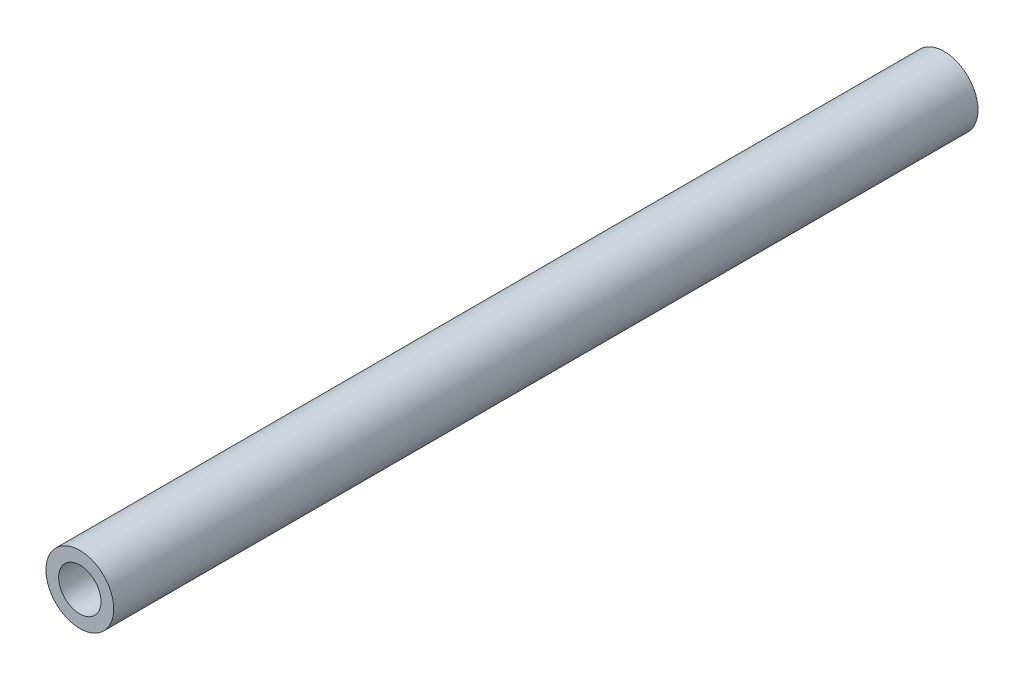
ISO-10303-21;
HEADER;
FILE_DESCRIPTION(('STEP AP214'),'2;1');
FILE_NAME('part.step','',(''),(''),'','','');
FILE_SCHEMA(('AUTOMOTIVE_DESIGN { 1 0 10303 214 1 1 1 1 }'));
ENDSEC;
DATA;
#1=APPLICATION_CONTEXT('core data for automotive mechanical design processes');
#2=APPLICATION_PROTOCOL_DEFINITION('international standard','automotive_design',2000,#1);
#3=PRODUCT_CONTEXT('',#1,'mechanical');
#4=PRODUCT('Part','Part','',(#3));
#5=PRODUCT_RELATED_PRODUCT_CATEGORY('part','',(#4));
#6=PRODUCT_DEFINITION_FORMATION('','',#4);
#7=PRODUCT_DEFINITION_CONTEXT('part definition',#1,'design');
#8=PRODUCT_DEFINITION('design','',#6,#7);
#9=PRODUCT_DEFINITION_SHAPE('','',#8);
#10=(LENGTH_UNIT() NAMED_UNIT(*) SI_UNIT(.MILLI.,.METRE.));
#11=(NAMED_UNIT(*) PLANE_ANGLE_UNIT() SI_UNIT($,.RADIAN.));
#12=(NAMED_UNIT(*) SI_UNIT($,.STERADIAN.) SOLID_ANGLE_UNIT());
#13=UNCERTAINTY_MEASURE_WITH_UNIT(LENGTH_MEASURE(1.E-05),#10,'distance_accuracy_value','');
#14=(GEOMETRIC_REPRESENTATION_CONTEXT(3) GLOBAL_UNCERTAINTY_ASSIGNED_CONTEXT((#13)) GLOBAL_UNIT_ASSIGNED_CONTEXT((#10,
#11,#12)) REPRESENTATION_CONTEXT('',''));
#15=CARTESIAN_POINT('',(0.,0.,0.));
#16=DIRECTION('',(0.,0.,1.));
#17=DIRECTION('',(1.,0.,0.));
#18=AXIS2_PLACEMENT_3D('',#15,#16,#17);
#19=CARTESIAN_POINT('',(0.,0.,102.));
#20=DIRECTION('',(0.,0.,-1.));
#21=DIRECTION('',(-1.,0.,0.));
#22=AXIS2_PLACEMENT_3D('',#19,#20,#21);
#23=CYLINDRICAL_SURFACE('',#22,4.);
#24=CARTESIAN_POINT('',(0.,0.,62.));
#25=DIRECTION('',(0.,0.,1.));
#26=DIRECTION('',(1.,0.,0.));
#27=AXIS2_PLACEMENT_3D('',#24,#25,#26);
#28=CIRCLE('',#27,4.);
#29=CARTESIAN_POINT('',(4.,0.,62.));
#30=VERTEX_POINT('',#29);
#31=EDGE_CURVE('E46',#30,#30,#28,.T.);
#32=ORIENTED_EDGE('',*,*,#31,.T.);
#33=EDGE_LOOP('',(#32));
#34=FACE_BOUND('',#33,.T.);
#35=CARTESIAN_POINT('',(0.,0.,-72.));
#36=DIRECTION('',(0.,0.,-1.));
#37=DIRECTION('',(-1.,0.,0.));
#38=AXIS2_PLACEMENT_3D('',#35,#36,#37);
#39=CIRCLE('',#38,4.);
#40=CARTESIAN_POINT('',(-4.,0.,-72.));
#41=VERTEX_POINT('',#40);
#42=EDGE_CURVE('E37',#41,#41,#39,.T.);
#43=ORIENTED_EDGE('',*,*,#42,.T.);
#44=EDGE_LOOP('',(#43));
#45=FACE_BOUND('',#44,.T.);
#46=ADVANCED_FACE('F33',(#34,#45),#23,.F.);
#47=CARTESIAN_POINT('',(0.,0.,102.));
#48=DIRECTION('',(0.,0.,1.));
#49=DIRECTION('',(1.,0.,0.));
#50=AXIS2_PLACEMENT_3D('',#47,#48,#49);
#51=PLANE('',#50);
#52=CARTESIAN_POINT('',(0.,0.,102.));
#53=DIRECTION('',(0.,0.,1.));
#54=DIRECTION('',(1.,0.,0.));
#55=AXIS2_PLACEMENT_3D('',#52,#53,#54);
#56=CIRCLE('',#55,5.);
#57=CARTESIAN_POINT('',(5.,0.,102.));
#58=VERTEX_POINT('',#57);
#59=EDGE_CURVE('E49',#58,#58,#56,.T.);
#60=ORIENTED_EDGE('',*,*,#59,.F.);
#61=EDGE_LOOP('',(#60));
#62=FACE_BOUND('',#61,.T.);
#63=CARTESIAN_POINT('',(0.,0.,102.));
#64=DIRECTION('',(0.,0.,1.));
#65=DIRECTION('',(1.,0.,0.));
#66=AXIS2_PLACEMENT_3D('',#63,#64,#65);
#67=CIRCLE('',#66,8.);
#68=CARTESIAN_POINT('',(8.,0.,102.));
#69=VERTEX_POINT('',#68);
#70=EDGE_CURVE('E10',#69,#69,#67,.T.);
#71=ORIENTED_EDGE('',*,*,#70,.T.);
#72=EDGE_LOOP('',(#71));
#73=FACE_BOUND('',#72,.T.);
#74=ADVANCED_FACE('F82',(#62,#73),#51,.T.);
#75=CARTESIAN_POINT('',(0.,0.,-102.));
#76=DIRECTION('',(0.,0.,1.));
#77=DIRECTION('',(1.,0.,0.));
#78=AXIS2_PLACEMENT_3D('',#75,#76,#77);
#79=PLANE('',#78);
#80=CARTESIAN_POINT('',(0.,0.,-102.));
#81=DIRECTION('',(0.,0.,-1.));
#82=DIRECTION('',(-1.,0.,0.));
#83=AXIS2_PLACEMENT_3D('',#80,#81,#82);
#84=CIRCLE('',#83,5.);
#85=CARTESIAN_POINT('',(-5.,0.,-102.));
#86=VERTEX_POINT('',#85);
#87=EDGE_CURVE('E60',#86,#86,#84,.T.);
#88=ORIENTED_EDGE('',*,*,#87,.F.);
#89=EDGE_LOOP('',(#88));
#90=FACE_BOUND('',#89,.T.);
#91=CARTESIAN_POINT('',(0.,0.,-102.));
#92=DIRECTION('',(0.,0.,1.));
#93=DIRECTION('',(1.,0.,0.));
#94=AXIS2_PLACEMENT_3D('',#91,#92,#93);
#95=CIRCLE('',#94,8.);
#96=CARTESIAN_POINT('',(8.,0.,-102.));
#97=VERTEX_POINT('',#96);
#98=EDGE_CURVE('E41',#97,#97,#95,.T.);
#99=ORIENTED_EDGE('',*,*,#98,.F.);
#100=EDGE_LOOP('',(#99));
#101=FACE_BOUND('',#100,.T.);
#102=ADVANCED_FACE('F87',(#90,#101),#79,.F.);
#103=CARTESIAN_POINT('',(0.,0.,102.));
#104=DIRECTION('',(0.,0.,-1.));
#105=DIRECTION('',(-1.,0.,0.));
#106=AXIS2_PLACEMENT_3D('',#103,#104,#105);
#107=CYLINDRICAL_SURFACE('',#106,8.);
#108=ORIENTED_EDGE('',*,*,#70,.F.);
#109=EDGE_LOOP('',(#108));
#110=FACE_BOUND('',#109,.T.);
#111=ORIENTED_EDGE('',*,*,#98,.T.);
#112=EDGE_LOOP('',(#111));
#113=FACE_BOUND('',#112,.T.);
#114=ADVANCED_FACE('F35',(#110,#113),#107,.T.);
#115=CARTESIAN_POINT('',(0.,0.,62.));
#116=DIRECTION('',(0.,0.,1.));
#117=DIRECTION('',(1.,0.,0.));
#118=AXIS2_PLACEMENT_3D('',#115,#116,#117);
#119=CYLINDRICAL_SURFACE('',#118,5.);
#120=CARTESIAN_POINT('',(0.,0.,62.));
#121=DIRECTION('',(0.,0.,1.));
#122=DIRECTION('',(1.,0.,0.));
#123=AXIS2_PLACEMENT_3D('',#120,#121,#122);
#124=CIRCLE('',#123,5.);
#125=CARTESIAN_POINT('',(5.,0.,62.));
#126=VERTEX_POINT('',#125);
#127=EDGE_CURVE('E52',#126,#126,#124,.T.);
#128=ORIENTED_EDGE('',*,*,#127,.F.);
#129=EDGE_LOOP('',(#128));
#130=FACE_BOUND('',#129,.T.);
#131=ORIENTED_EDGE('',*,*,#59,.T.);
#132=EDGE_LOOP('',(#131));
#133=FACE_BOUND('',#132,.T.);
#134=ADVANCED_FACE('F91',(#130,#133),#119,.F.);
#135=CARTESIAN_POINT('',(0.,0.,62.));
#136=DIRECTION('',(0.,0.,1.));
#137=DIRECTION('',(1.,0.,0.));
#138=AXIS2_PLACEMENT_3D('',#135,#136,#137);
#139=PLANE('',#138);
#140=ORIENTED_EDGE('',*,*,#31,.F.);
#141=EDGE_LOOP('',(#140));
#142=FACE_BOUND('',#141,.T.);
#143=ORIENTED_EDGE('',*,*,#127,.T.);
#144=EDGE_LOOP('',(#143));
#145=FACE_BOUND('',#144,.T.);
#146=ADVANCED_FACE('F78',(#142,#145),#139,.T.);
#147=CARTESIAN_POINT('',(0.,0.,-72.));
#148=DIRECTION('',(0.,0.,-1.));
#149=DIRECTION('',(-1.,0.,0.));
#150=AXIS2_PLACEMENT_3D('',#147,#148,#149);
#151=CYLINDRICAL_SURFACE('',#150,5.);
#152=CARTESIAN_POINT('',(0.,0.,-72.));
#153=DIRECTION('',(0.,0.,-1.));
#154=DIRECTION('',(-1.,0.,0.));
#155=AXIS2_PLACEMENT_3D('',#152,#153,#154);
#156=CIRCLE('',#155,5.);
#157=CARTESIAN_POINT('',(-5.,0.,-72.));
#158=VERTEX_POINT('',#157);
#159=EDGE_CURVE('E63',#158,#158,#156,.T.);
#160=ORIENTED_EDGE('',*,*,#159,.F.);
#161=EDGE_LOOP('',(#160));
#162=FACE_BOUND('',#161,.T.);
#163=ORIENTED_EDGE('',*,*,#87,.T.);
#164=EDGE_LOOP('',(#163));
#165=FACE_BOUND('',#164,.T.);
#166=ADVANCED_FACE('F73',(#162,#165),#151,.F.);
#167=CARTESIAN_POINT('',(0.,0.,-72.));
#168=DIRECTION('',(0.,0.,-1.));
#169=DIRECTION('',(-1.,0.,0.));
#170=AXIS2_PLACEMENT_3D('',#167,#168,#169);
#171=PLANE('',#170);
#172=ORIENTED_EDGE('',*,*,#42,.F.);
#173=EDGE_LOOP('',(#172));
#174=FACE_BOUND('',#173,.T.);
#175=ORIENTED_EDGE('',*,*,#159,.T.);
#176=EDGE_LOOP('',(#175));
#177=FACE_BOUND('',#176,.T.);
#178=ADVANCED_FACE('F71',(#174,#177),#171,.T.);
#179=CLOSED_SHELL('',(#46,#74,#102,#114,#134,#146,#166,#178));
#180=MANIFOLD_SOLID_BREP('B2',#179);
#181=ADVANCED_BREP_SHAPE_REPRESENTATION('',(#18,#180),#14);
#182=SHAPE_DEFINITION_REPRESENTATION(#9,#181);
ENDSEC;
END-ISO-10303-21;
